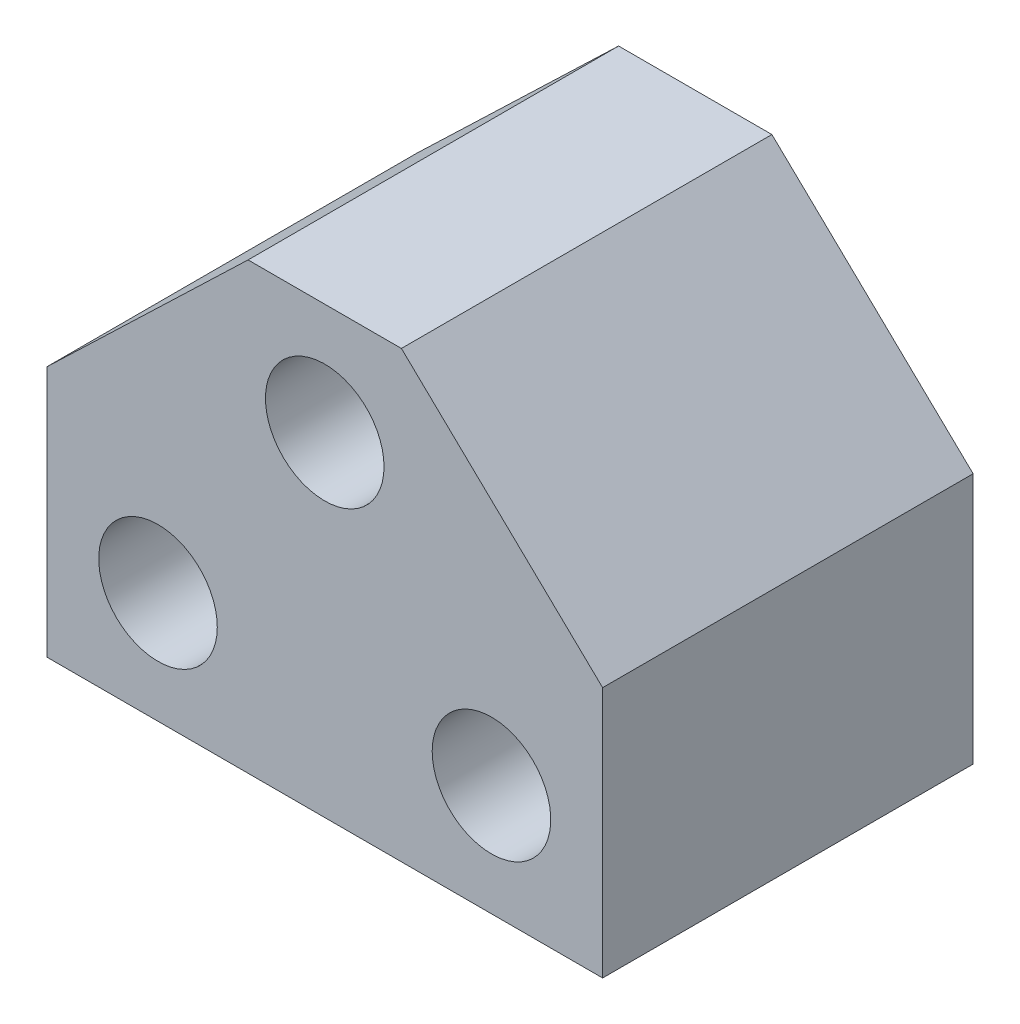
ISO-10303-21;
HEADER;
FILE_DESCRIPTION(('STEP AP214'),'2;1');
FILE_NAME('part.step','',(''),(''),'','','');
FILE_SCHEMA(('AUTOMOTIVE_DESIGN { 1 0 10303 214 1 1 1 1 }'));
ENDSEC;
DATA;
#1=APPLICATION_CONTEXT('core data for automotive mechanical design processes');
#2=APPLICATION_PROTOCOL_DEFINITION('international standard','automotive_design',2000,#1);
#3=PRODUCT_CONTEXT('',#1,'mechanical');
#4=PRODUCT('Part','Part','',(#3));
#5=PRODUCT_RELATED_PRODUCT_CATEGORY('part','',(#4));
#6=PRODUCT_DEFINITION_FORMATION('','',#4);
#7=PRODUCT_DEFINITION_CONTEXT('part definition',#1,'design');
#8=PRODUCT_DEFINITION('design','',#6,#7);
#9=PRODUCT_DEFINITION_SHAPE('','',#8);
#10=(LENGTH_UNIT() NAMED_UNIT(*) SI_UNIT(.MILLI.,.METRE.));
#11=(NAMED_UNIT(*) PLANE_ANGLE_UNIT() SI_UNIT($,.RADIAN.));
#12=(NAMED_UNIT(*) SI_UNIT($,.STERADIAN.) SOLID_ANGLE_UNIT());
#13=UNCERTAINTY_MEASURE_WITH_UNIT(LENGTH_MEASURE(1.E-05),#10,'distance_accuracy_value','');
#14=(GEOMETRIC_REPRESENTATION_CONTEXT(3) GLOBAL_UNCERTAINTY_ASSIGNED_CONTEXT((#13)) GLOBAL_UNIT_ASSIGNED_CONTEXT((#10,
#11,#12)) REPRESENTATION_CONTEXT('',''));
#15=CARTESIAN_POINT('',(0.,0.,0.));
#16=DIRECTION('',(0.,0.,1.));
#17=DIRECTION('',(1.,0.,0.));
#18=AXIS2_PLACEMENT_3D('',#15,#16,#17);
#19=CARTESIAN_POINT('',(0.,0.,10.));
#20=DIRECTION('',(0.,0.,-1.));
#21=DIRECTION('',(-1.,0.,0.));
#22=AXIS2_PLACEMENT_3D('',#19,#20,#21);
#23=PLANE('',#22);
#24=DIRECTION('',(0.,-1.,0.));
#25=VECTOR('',#24,1.);
#26=CARTESIAN_POINT('',(-7.49999999999999,0.,10.));
#27=LINE('',#26,#25);
#28=CARTESIAN_POINT('',(-7.49999999999999,6.78663835017543,10.));
#29=VERTEX_POINT('',#28);
#30=CARTESIAN_POINT('',(-7.49999999999999,0.,10.));
#31=VERTEX_POINT('',#30);
#32=EDGE_CURVE('E60',#29,#31,#27,.T.);
#33=ORIENTED_EDGE('',*,*,#32,.T.);
#34=DIRECTION('',(1.,0.,0.));
#35=VECTOR('',#34,1.);
#36=CARTESIAN_POINT('',(7.50000000000001,0.,10.));
#37=LINE('',#36,#35);
#38=CARTESIAN_POINT('',(7.50000000000001,0.,10.));
#39=VERTEX_POINT('',#38);
#40=EDGE_CURVE('E98',#31,#39,#37,.T.);
#41=ORIENTED_EDGE('',*,*,#40,.T.);
#42=DIRECTION('',(0.,1.,0.));
#43=VECTOR('',#42,1.);
#44=CARTESIAN_POINT('',(7.50000000000001,0.,10.));
#45=LINE('',#44,#43);
#46=CARTESIAN_POINT('',(7.50000000000001,6.78663835017543,10.));
#47=VERTEX_POINT('',#46);
#48=EDGE_CURVE('E112',#39,#47,#45,.T.);
#49=ORIENTED_EDGE('',*,*,#48,.T.);
#50=DIRECTION('',(-0.721415952009602,0.692502003019544,0.));
#51=VECTOR('',#50,1.);
#52=CARTESIAN_POINT('',(2.0689655172414,12.,10.));
#53=LINE('',#52,#51);
#54=CARTESIAN_POINT('',(2.0689655172414,12.,10.));
#55=VERTEX_POINT('',#54);
#56=EDGE_CURVE('E106',#47,#55,#53,.T.);
#57=ORIENTED_EDGE('',*,*,#56,.T.);
#58=DIRECTION('',(-1.,0.,0.));
#59=VECTOR('',#58,1.);
#60=CARTESIAN_POINT('',(-2.06896551724138,12.,10.));
#61=LINE('',#60,#59);
#62=CARTESIAN_POINT('',(-2.06896551724138,12.,10.));
#63=VERTEX_POINT('',#62);
#64=EDGE_CURVE('E110',#55,#63,#61,.T.);
#65=ORIENTED_EDGE('',*,*,#64,.T.);
#66=DIRECTION('',(-0.721415952009602,-0.692502003019544,0.));
#67=VECTOR('',#66,1.);
#68=CARTESIAN_POINT('',(-2.06896551724138,12.,10.));
#69=LINE('',#68,#67);
#70=EDGE_CURVE('E126',#63,#29,#69,.T.);
#71=ORIENTED_EDGE('',*,*,#70,.T.);
#72=EDGE_LOOP('',(#33,#41,#49,#57,#65,#71));
#73=FACE_BOUND('',#72,.T.);
#74=CARTESIAN_POINT('',(-4.49999999999999,3.,10.));
#75=DIRECTION('',(0.,0.,1.));
#76=DIRECTION('',(1.,0.,0.));
#77=AXIS2_PLACEMENT_3D('',#74,#75,#76);
#78=CIRCLE('',#77,1.6);
#79=CARTESIAN_POINT('',(-2.89999999999999,3.,10.));
#80=VERTEX_POINT('',#79);
#81=EDGE_CURVE('E136',#80,#80,#78,.T.);
#82=ORIENTED_EDGE('',*,*,#81,.F.);
#83=EDGE_LOOP('',(#82));
#84=FACE_BOUND('',#83,.T.);
#85=CARTESIAN_POINT('',(0.,9.,10.));
#86=DIRECTION('',(0.,0.,1.));
#87=DIRECTION('',(1.,0.,0.));
#88=AXIS2_PLACEMENT_3D('',#85,#86,#87);
#89=CIRCLE('',#88,1.6);
#90=CARTESIAN_POINT('',(1.60000000000001,9.,10.));
#91=VERTEX_POINT('',#90);
#92=EDGE_CURVE('E161',#91,#91,#89,.T.);
#93=ORIENTED_EDGE('',*,*,#92,.F.);
#94=EDGE_LOOP('',(#93));
#95=FACE_BOUND('',#94,.T.);
#96=CARTESIAN_POINT('',(4.5,3.,10.));
#97=DIRECTION('',(0.,0.,1.));
#98=DIRECTION('',(-1.,0.,0.));
#99=AXIS2_PLACEMENT_3D('',#96,#97,#98);
#100=CIRCLE('',#99,1.6);
#101=CARTESIAN_POINT('',(2.9,3.,10.));
#102=VERTEX_POINT('',#101);
#103=EDGE_CURVE('E167',#102,#102,#100,.T.);
#104=ORIENTED_EDGE('',*,*,#103,.F.);
#105=EDGE_LOOP('',(#104));
#106=FACE_BOUND('',#105,.T.);
#107=ADVANCED_FACE('F43',(#73,#84,#95,#106),#23,.F.);
#108=CARTESIAN_POINT('',(0.,0.,0.));
#109=DIRECTION('',(0.,0.,-1.));
#110=DIRECTION('',(-1.,0.,0.));
#111=AXIS2_PLACEMENT_3D('',#108,#109,#110);
#112=PLANE('',#111);
#113=CARTESIAN_POINT('',(0.,9.,0.));
#114=DIRECTION('',(0.,0.,1.));
#115=DIRECTION('',(1.,0.,0.));
#116=AXIS2_PLACEMENT_3D('',#113,#114,#115);
#117=CIRCLE('',#116,1.6);
#118=CARTESIAN_POINT('',(1.60000000000001,9.,0.));
#119=VERTEX_POINT('',#118);
#120=EDGE_CURVE('E164',#119,#119,#117,.T.);
#121=ORIENTED_EDGE('',*,*,#120,.T.);
#122=EDGE_LOOP('',(#121));
#123=FACE_BOUND('',#122,.T.);
#124=DIRECTION('',(1.,0.,0.));
#125=VECTOR('',#124,1.);
#126=CARTESIAN_POINT('',(7.50000000000001,0.,0.));
#127=LINE('',#126,#125);
#128=CARTESIAN_POINT('',(-7.49999999999999,0.,0.));
#129=VERTEX_POINT('',#128);
#130=CARTESIAN_POINT('',(7.50000000000001,0.,0.));
#131=VERTEX_POINT('',#130);
#132=EDGE_CURVE('E132',#129,#131,#127,.T.);
#133=ORIENTED_EDGE('',*,*,#132,.F.);
#134=DIRECTION('',(0.,-1.,0.));
#135=VECTOR('',#134,1.);
#136=CARTESIAN_POINT('',(-7.49999999999999,6.78663835017543,0.));
#137=LINE('',#136,#135);
#138=CARTESIAN_POINT('',(-7.49999999999999,6.78663835017543,0.));
#139=VERTEX_POINT('',#138);
#140=EDGE_CURVE('E141',#139,#129,#137,.T.);
#141=ORIENTED_EDGE('',*,*,#140,.F.);
#142=DIRECTION('',(-0.721415952009602,-0.692502003019544,0.));
#143=VECTOR('',#142,1.);
#144=CARTESIAN_POINT('',(-2.06896551724138,12.,0.));
#145=LINE('',#144,#143);
#146=CARTESIAN_POINT('',(-2.06896551724138,12.,0.));
#147=VERTEX_POINT('',#146);
#148=EDGE_CURVE('E91',#147,#139,#145,.T.);
#149=ORIENTED_EDGE('',*,*,#148,.F.);
#150=DIRECTION('',(-1.,0.,0.));
#151=VECTOR('',#150,1.);
#152=CARTESIAN_POINT('',(-2.06896551724138,12.,0.));
#153=LINE('',#152,#151);
#154=CARTESIAN_POINT('',(2.0689655172414,12.,0.));
#155=VERTEX_POINT('',#154);
#156=EDGE_CURVE('E84',#155,#147,#153,.T.);
#157=ORIENTED_EDGE('',*,*,#156,.F.);
#158=DIRECTION('',(-0.721415952009602,0.692502003019544,0.));
#159=VECTOR('',#158,1.);
#160=CARTESIAN_POINT('',(2.0689655172414,12.,0.));
#161=LINE('',#160,#159);
#162=CARTESIAN_POINT('',(7.50000000000001,6.78663835017543,0.));
#163=VERTEX_POINT('',#162);
#164=EDGE_CURVE('E120',#163,#155,#161,.T.);
#165=ORIENTED_EDGE('',*,*,#164,.F.);
#166=DIRECTION('',(0.,1.,0.));
#167=VECTOR('',#166,1.);
#168=CARTESIAN_POINT('',(7.50000000000001,6.78663835017543,0.));
#169=LINE('',#168,#167);
#170=EDGE_CURVE('E135',#131,#163,#169,.T.);
#171=ORIENTED_EDGE('',*,*,#170,.F.);
#172=EDGE_LOOP('',(#133,#141,#149,#157,#165,#171));
#173=FACE_BOUND('',#172,.T.);
#174=CARTESIAN_POINT('',(-4.49999999999999,3.,0.));
#175=DIRECTION('',(0.,0.,1.));
#176=DIRECTION('',(1.,0.,0.));
#177=AXIS2_PLACEMENT_3D('',#174,#175,#176);
#178=CIRCLE('',#177,1.6);
#179=CARTESIAN_POINT('',(-2.89999999999999,3.,0.));
#180=VERTEX_POINT('',#179);
#181=EDGE_CURVE('E158',#180,#180,#178,.T.);
#182=ORIENTED_EDGE('',*,*,#181,.T.);
#183=EDGE_LOOP('',(#182));
#184=FACE_BOUND('',#183,.T.);
#185=CARTESIAN_POINT('',(4.5,3.,0.));
#186=DIRECTION('',(0.,0.,1.));
#187=DIRECTION('',(-1.,0.,0.));
#188=AXIS2_PLACEMENT_3D('',#185,#186,#187);
#189=CIRCLE('',#188,1.6);
#190=CARTESIAN_POINT('',(2.9,3.,0.));
#191=VERTEX_POINT('',#190);
#192=EDGE_CURVE('E170',#191,#191,#189,.T.);
#193=ORIENTED_EDGE('',*,*,#192,.T.);
#194=EDGE_LOOP('',(#193));
#195=FACE_BOUND('',#194,.T.);
#196=ADVANCED_FACE('F151',(#123,#173,#184,#195),#112,.T.);
#197=CARTESIAN_POINT('',(7.50000000000001,0.,10.));
#198=DIRECTION('',(0.,1.,0.));
#199=DIRECTION('',(0.,0.,1.));
#200=AXIS2_PLACEMENT_3D('',#197,#198,#199);
#201=PLANE('',#200);
#202=ORIENTED_EDGE('',*,*,#132,.T.);
#203=DIRECTION('',(0.,0.,-1.));
#204=VECTOR('',#203,1.);
#205=CARTESIAN_POINT('',(7.50000000000001,0.,10.));
#206=LINE('',#205,#204);
#207=EDGE_CURVE('E52',#39,#131,#206,.T.);
#208=ORIENTED_EDGE('',*,*,#207,.F.);
#209=ORIENTED_EDGE('',*,*,#40,.F.);
#210=DIRECTION('',(0.,0.,-1.));
#211=VECTOR('',#210,1.);
#212=CARTESIAN_POINT('',(-7.49999999999999,0.,10.));
#213=LINE('',#212,#211);
#214=EDGE_CURVE('E11',#31,#129,#213,.T.);
#215=ORIENTED_EDGE('',*,*,#214,.T.);
#216=EDGE_LOOP('',(#202,#208,#209,#215));
#217=FACE_BOUND('',#216,.T.);
#218=ADVANCED_FACE('F45',(#217),#201,.F.);
#219=CARTESIAN_POINT('',(7.50000000000001,6.78663835017543,10.));
#220=DIRECTION('',(-1.,0.,0.));
#221=DIRECTION('',(0.,0.,1.));
#222=AXIS2_PLACEMENT_3D('',#219,#220,#221);
#223=PLANE('',#222);
#224=ORIENTED_EDGE('',*,*,#170,.T.);
#225=DIRECTION('',(0.,0.,-1.));
#226=VECTOR('',#225,1.);
#227=CARTESIAN_POINT('',(7.50000000000001,6.78663835017543,10.));
#228=LINE('',#227,#226);
#229=EDGE_CURVE('E121',#47,#163,#228,.T.);
#230=ORIENTED_EDGE('',*,*,#229,.F.);
#231=ORIENTED_EDGE('',*,*,#48,.F.);
#232=ORIENTED_EDGE('',*,*,#207,.T.);
#233=EDGE_LOOP('',(#224,#230,#231,#232));
#234=FACE_BOUND('',#233,.T.);
#235=ADVANCED_FACE('F147',(#234),#223,.F.);
#236=CARTESIAN_POINT('',(2.0689655172414,12.,10.));
#237=DIRECTION('',(-0.692502003019544,-0.721415952009602,0.));
#238=DIRECTION('',(0.721415952009602,-0.692502003019544,0.));
#239=AXIS2_PLACEMENT_3D('',#236,#237,#238);
#240=PLANE('',#239);
#241=ORIENTED_EDGE('',*,*,#164,.T.);
#242=DIRECTION('',(0.,0.,-1.));
#243=VECTOR('',#242,1.);
#244=CARTESIAN_POINT('',(2.0689655172414,12.,10.));
#245=LINE('',#244,#243);
#246=EDGE_CURVE('E117',#55,#155,#245,.T.);
#247=ORIENTED_EDGE('',*,*,#246,.F.);
#248=ORIENTED_EDGE('',*,*,#56,.F.);
#249=ORIENTED_EDGE('',*,*,#229,.T.);
#250=EDGE_LOOP('',(#241,#247,#248,#249));
#251=FACE_BOUND('',#250,.T.);
#252=ADVANCED_FACE('F118',(#251),#240,.F.);
#253=CARTESIAN_POINT('',(-2.06896551724138,12.,10.));
#254=DIRECTION('',(0.,-1.,0.));
#255=DIRECTION('',(0.,0.,-1.));
#256=AXIS2_PLACEMENT_3D('',#253,#254,#255);
#257=PLANE('',#256);
#258=ORIENTED_EDGE('',*,*,#156,.T.);
#259=DIRECTION('',(0.,0.,-1.));
#260=VECTOR('',#259,1.);
#261=CARTESIAN_POINT('',(-2.06896551724138,12.,10.));
#262=LINE('',#261,#260);
#263=EDGE_CURVE('E122',#63,#147,#262,.T.);
#264=ORIENTED_EDGE('',*,*,#263,.F.);
#265=ORIENTED_EDGE('',*,*,#64,.F.);
#266=ORIENTED_EDGE('',*,*,#246,.T.);
#267=EDGE_LOOP('',(#258,#264,#265,#266));
#268=FACE_BOUND('',#267,.T.);
#269=ADVANCED_FACE('F124',(#268),#257,.F.);
#270=CARTESIAN_POINT('',(-2.06896551724138,12.,10.));
#271=DIRECTION('',(0.692502003019544,-0.721415952009602,0.));
#272=DIRECTION('',(0.721415952009602,0.692502003019544,0.));
#273=AXIS2_PLACEMENT_3D('',#270,#271,#272);
#274=PLANE('',#273);
#275=ORIENTED_EDGE('',*,*,#148,.T.);
#276=DIRECTION('',(0.,0.,-1.));
#277=VECTOR('',#276,1.);
#278=CARTESIAN_POINT('',(-7.49999999999999,6.78663835017543,10.));
#279=LINE('',#278,#277);
#280=EDGE_CURVE('E128',#29,#139,#279,.T.);
#281=ORIENTED_EDGE('',*,*,#280,.F.);
#282=ORIENTED_EDGE('',*,*,#70,.F.);
#283=ORIENTED_EDGE('',*,*,#263,.T.);
#284=EDGE_LOOP('',(#275,#281,#282,#283));
#285=FACE_BOUND('',#284,.T.);
#286=ADVANCED_FACE('F154',(#285),#274,.F.);
#287=CARTESIAN_POINT('',(-7.49999999999999,6.78663835017543,10.));
#288=DIRECTION('',(1.,0.,0.));
#289=DIRECTION('',(0.,0.,-1.));
#290=AXIS2_PLACEMENT_3D('',#287,#288,#289);
#291=PLANE('',#290);
#292=ORIENTED_EDGE('',*,*,#140,.T.);
#293=ORIENTED_EDGE('',*,*,#214,.F.);
#294=ORIENTED_EDGE('',*,*,#32,.F.);
#295=ORIENTED_EDGE('',*,*,#280,.T.);
#296=EDGE_LOOP('',(#292,#293,#294,#295));
#297=FACE_BOUND('',#296,.T.);
#298=ADVANCED_FACE('F153',(#297),#291,.F.);
#299=CARTESIAN_POINT('',(-4.49999999999999,3.,10.));
#300=DIRECTION('',(0.,0.,-1.));
#301=DIRECTION('',(-1.,0.,0.));
#302=AXIS2_PLACEMENT_3D('',#299,#300,#301);
#303=CYLINDRICAL_SURFACE('',#302,1.6);
#304=ORIENTED_EDGE('',*,*,#81,.T.);
#305=EDGE_LOOP('',(#304));
#306=FACE_BOUND('',#305,.T.);
#307=ORIENTED_EDGE('',*,*,#181,.F.);
#308=EDGE_LOOP('',(#307));
#309=FACE_BOUND('',#308,.T.);
#310=ADVANCED_FACE('F187',(#306,#309),#303,.F.);
#311=CARTESIAN_POINT('',(0.,9.,10.));
#312=DIRECTION('',(0.,0.,-1.));
#313=DIRECTION('',(-1.,0.,0.));
#314=AXIS2_PLACEMENT_3D('',#311,#312,#313);
#315=CYLINDRICAL_SURFACE('',#314,1.6);
#316=ORIENTED_EDGE('',*,*,#92,.T.);
#317=EDGE_LOOP('',(#316));
#318=FACE_BOUND('',#317,.T.);
#319=ORIENTED_EDGE('',*,*,#120,.F.);
#320=EDGE_LOOP('',(#319));
#321=FACE_BOUND('',#320,.T.);
#322=ADVANCED_FACE('F248',(#318,#321),#315,.F.);
#323=CARTESIAN_POINT('',(4.5,3.,10.));
#324=DIRECTION('',(0.,0.,-1.));
#325=DIRECTION('',(-1.,0.,0.));
#326=AXIS2_PLACEMENT_3D('',#323,#324,#325);
#327=CYLINDRICAL_SURFACE('',#326,1.6);
#328=ORIENTED_EDGE('',*,*,#103,.T.);
#329=EDGE_LOOP('',(#328));
#330=FACE_BOUND('',#329,.T.);
#331=ORIENTED_EDGE('',*,*,#192,.F.);
#332=EDGE_LOOP('',(#331));
#333=FACE_BOUND('',#332,.T.);
#334=ADVANCED_FACE('F176',(#330,#333),#327,.F.);
#335=CLOSED_SHELL('',(#107,#196,#218,#235,#252,#269,#286,#298,#310,#322,#334));
#336=MANIFOLD_SOLID_BREP('B2',#335);
#337=ADVANCED_BREP_SHAPE_REPRESENTATION('',(#18,#336),#14);
#338=SHAPE_DEFINITION_REPRESENTATION(#9,#337);
ENDSEC;
END-ISO-10303-21;
